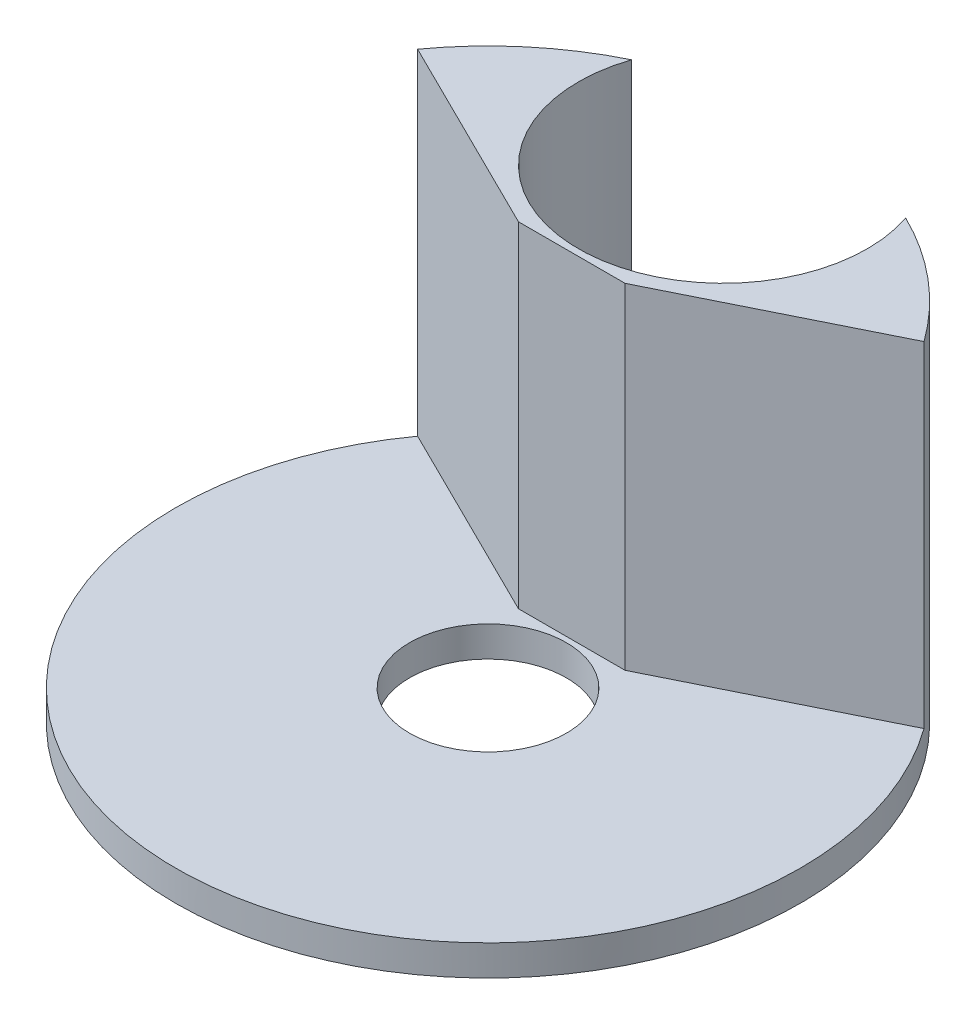
ISO-10303-21;
HEADER;
FILE_DESCRIPTION(('STEP AP214'),'2;1');
FILE_NAME('part.step','',(''),(''),'','','');
FILE_SCHEMA(('AUTOMOTIVE_DESIGN { 1 0 10303 214 1 1 1 1 }'));
ENDSEC;
DATA;
#1=APPLICATION_CONTEXT('core data for automotive mechanical design processes');
#2=APPLICATION_PROTOCOL_DEFINITION('international standard','automotive_design',2000,#1);
#3=PRODUCT_CONTEXT('',#1,'mechanical');
#4=PRODUCT('Part','Part','',(#3));
#5=PRODUCT_RELATED_PRODUCT_CATEGORY('part','',(#4));
#6=PRODUCT_DEFINITION_FORMATION('','',#4);
#7=PRODUCT_DEFINITION_CONTEXT('part definition',#1,'design');
#8=PRODUCT_DEFINITION('design','',#6,#7);
#9=PRODUCT_DEFINITION_SHAPE('','',#8);
#10=(LENGTH_UNIT() NAMED_UNIT(*) SI_UNIT(.MILLI.,.METRE.));
#11=(NAMED_UNIT(*) PLANE_ANGLE_UNIT() SI_UNIT($,.RADIAN.));
#12=(NAMED_UNIT(*) SI_UNIT($,.STERADIAN.) SOLID_ANGLE_UNIT());
#13=UNCERTAINTY_MEASURE_WITH_UNIT(LENGTH_MEASURE(1.E-05),#10,'distance_accuracy_value','');
#14=(GEOMETRIC_REPRESENTATION_CONTEXT(3) GLOBAL_UNCERTAINTY_ASSIGNED_CONTEXT((#13)) GLOBAL_UNIT_ASSIGNED_CONTEXT((#10,
#11,#12)) REPRESENTATION_CONTEXT('',''));
#15=CARTESIAN_POINT('',(0.,0.,0.));
#16=DIRECTION('',(0.,0.,1.));
#17=DIRECTION('',(1.,0.,0.));
#18=AXIS2_PLACEMENT_3D('',#15,#16,#17);
#19=CARTESIAN_POINT('',(0.,2.,0.));
#20=DIRECTION('',(0.,1.,0.));
#21=DIRECTION('',(0.,0.,1.));
#22=AXIS2_PLACEMENT_3D('',#19,#20,#21);
#23=PLANE('',#22);
#24=CARTESIAN_POINT('',(0.,2.,-13.));
#25=DIRECTION('',(0.,1.,0.));
#26=DIRECTION('',(0.,0.,1.));
#27=AXIS2_PLACEMENT_3D('',#24,#25,#26);
#28=CIRCLE('',#27,6.5);
#29=CARTESIAN_POINT('',(0.,2.,-6.5));
#30=VERTEX_POINT('',#29);
#31=EDGE_CURVE('E158',#30,#30,#28,.T.);
#32=ORIENTED_EDGE('',*,*,#31,.F.);
#33=EDGE_LOOP('',(#32));
#34=FACE_BOUND('',#33,.T.);
#35=CARTESIAN_POINT('',(0.,2.,0.));
#36=DIRECTION('',(0.,1.,0.));
#37=DIRECTION('',(0.,0.,1.));
#38=AXIS2_PLACEMENT_3D('',#35,#36,#37);
#39=CIRCLE('',#38,20.5);
#40=CARTESIAN_POINT('',(8.99999999999999,2.,-18.4187404563939));
#41=VERTEX_POINT('',#40);
#42=CARTESIAN_POINT('',(-9.00000000000001,2.,-18.4187404563939));
#43=VERTEX_POINT('',#42);
#44=EDGE_CURVE('E11',#41,#43,#39,.T.);
#45=ORIENTED_EDGE('',*,*,#44,.T.);
#46=CARTESIAN_POINT('',(0.,2.,-15.4184489779728));
#47=DIRECTION('',(0.,1.,0.));
#48=DIRECTION('',(0.,0.,1.));
#49=AXIS2_PLACEMENT_3D('',#46,#47,#48);
#50=CIRCLE('',#49,9.48692515810502);
#51=EDGE_CURVE('E136',#43,#41,#50,.T.);
#52=ORIENTED_EDGE('',*,*,#51,.T.);
#53=EDGE_LOOP('',(#45,#52));
#54=FACE_BOUND('',#53,.T.);
#55=ADVANCED_FACE('F41',(#34,#54),#23,.T.);
#56=CARTESIAN_POINT('',(0.,2.,0.));
#57=DIRECTION('',(0.,-1.,0.));
#58=DIRECTION('',(0.,0.,-1.));
#59=AXIS2_PLACEMENT_3D('',#56,#57,#58);
#60=CYLINDRICAL_SURFACE('',#59,20.5);
#61=ORIENTED_EDGE('',*,*,#44,.F.);
#62=DIRECTION('',(0.,-1.,0.));
#63=VECTOR('',#62,1.);
#64=CARTESIAN_POINT('',(8.99999999999999,24.,-18.4187404563939));
#65=LINE('',#64,#63);
#66=CARTESIAN_POINT('',(8.99999999999999,24.,-18.4187404563939));
#67=VERTEX_POINT('',#66);
#68=EDGE_CURVE('E91',#67,#41,#65,.T.);
#69=ORIENTED_EDGE('',*,*,#68,.F.);
#70=CARTESIAN_POINT('',(0.,24.,0.));
#71=DIRECTION('',(0.,1.,0.));
#72=DIRECTION('',(0.,0.,1.));
#73=AXIS2_PLACEMENT_3D('',#70,#71,#72);
#74=CIRCLE('',#73,20.5);
#75=CARTESIAN_POINT('',(16.6207701385947,24.,-12.));
#76=VERTEX_POINT('',#75);
#77=EDGE_CURVE('E68',#76,#67,#74,.T.);
#78=ORIENTED_EDGE('',*,*,#77,.F.);
#79=DIRECTION('',(0.,-1.,0.));
#80=VECTOR('',#79,1.);
#81=CARTESIAN_POINT('',(16.6207701385947,24.,-12.));
#82=LINE('',#81,#80);
#83=CARTESIAN_POINT('',(16.6207701385947,2.,-12.));
#84=VERTEX_POINT('',#83);
#85=EDGE_CURVE('E125',#76,#84,#82,.T.);
#86=ORIENTED_EDGE('',*,*,#85,.T.);
#87=CARTESIAN_POINT('',(-16.6207701385947,2.,-12.));
#88=VERTEX_POINT('',#87);
#89=EDGE_CURVE('E51',#88,#84,#39,.T.);
#90=ORIENTED_EDGE('',*,*,#89,.F.);
#91=DIRECTION('',(0.,-1.,0.));
#92=VECTOR('',#91,1.);
#93=CARTESIAN_POINT('',(-16.6207701385947,24.,-12.));
#94=LINE('',#93,#92);
#95=CARTESIAN_POINT('',(-16.6207701385947,24.,-12.));
#96=VERTEX_POINT('',#95);
#97=EDGE_CURVE('E59',#96,#88,#94,.T.);
#98=ORIENTED_EDGE('',*,*,#97,.F.);
#99=CARTESIAN_POINT('',(-9.00000000000001,24.,-18.4187404563939));
#100=VERTEX_POINT('',#99);
#101=EDGE_CURVE('E133',#100,#96,#74,.T.);
#102=ORIENTED_EDGE('',*,*,#101,.F.);
#103=DIRECTION('',(0.,-1.,0.));
#104=VECTOR('',#103,1.);
#105=CARTESIAN_POINT('',(-9.00000000000001,24.,-18.4187404563939));
#106=LINE('',#105,#104);
#107=EDGE_CURVE('E96',#100,#43,#106,.T.);
#108=ORIENTED_EDGE('',*,*,#107,.T.);
#109=EDGE_LOOP('',(#61,#69,#78,#86,#90,#98,#102,#108));
#110=FACE_BOUND('',#109,.T.);
#111=CARTESIAN_POINT('',(0.,0.,0.));
#112=DIRECTION('',(0.,1.,0.));
#113=DIRECTION('',(0.,0.,1.));
#114=AXIS2_PLACEMENT_3D('',#111,#112,#113);
#115=CIRCLE('',#114,20.5);
#116=CARTESIAN_POINT('',(0.,0.,20.5));
#117=VERTEX_POINT('',#116);
#118=EDGE_CURVE('E171',#117,#117,#115,.T.);
#119=ORIENTED_EDGE('',*,*,#118,.T.);
#120=EDGE_LOOP('',(#119));
#121=FACE_BOUND('',#120,.T.);
#122=ADVANCED_FACE('F43',(#110,#121),#60,.T.);
#123=DIRECTION('',(0.896070683062667,0.,-0.443911399893724));
#124=VECTOR('',#123,1.);
#125=CARTESIAN_POINT('',(-1.49806729392679,2.,-3.02396871011691));
#126=LINE('',#125,#124);
#127=CARTESIAN_POINT('',(3.5,2.,-5.5));
#128=VERTEX_POINT('',#127);
#129=EDGE_CURVE('E144',#128,#84,#126,.T.);
#130=ORIENTED_EDGE('',*,*,#129,.F.);
#131=DIRECTION('',(1.,0.,0.));
#132=VECTOR('',#131,1.);
#133=CARTESIAN_POINT('',(0.,2.,-5.5));
#134=LINE('',#133,#132);
#135=CARTESIAN_POINT('',(-3.5,2.,-5.5));
#136=VERTEX_POINT('',#135);
#137=EDGE_CURVE('E120',#136,#128,#134,.T.);
#138=ORIENTED_EDGE('',*,*,#137,.F.);
#139=DIRECTION('',(-0.896070683062667,0.,-0.443911399893724));
#140=VECTOR('',#139,1.);
#141=CARTESIAN_POINT('',(1.49806729392679,2.,-3.02396871011691));
#142=LINE('',#141,#140);
#143=EDGE_CURVE('E139',#136,#88,#142,.T.);
#144=ORIENTED_EDGE('',*,*,#143,.T.);
#145=ORIENTED_EDGE('',*,*,#89,.T.);
#146=EDGE_LOOP('',(#130,#138,#144,#145));
#147=FACE_BOUND('',#146,.T.);
#148=CARTESIAN_POINT('',(0.,2.,0.));
#149=DIRECTION('',(0.,1.,0.));
#150=DIRECTION('',(0.,0.,1.));
#151=AXIS2_PLACEMENT_3D('',#148,#149,#150);
#152=CIRCLE('',#151,5.15);
#153=CARTESIAN_POINT('',(0.,2.,5.15));
#154=VERTEX_POINT('',#153);
#155=EDGE_CURVE('E163',#154,#154,#152,.T.);
#156=ORIENTED_EDGE('',*,*,#155,.F.);
#157=EDGE_LOOP('',(#156));
#158=FACE_BOUND('',#157,.T.);
#159=ADVANCED_FACE('F197',(#147,#158),#23,.T.);
#160=CARTESIAN_POINT('',(0.,0.,0.));
#161=DIRECTION('',(0.,1.,0.));
#162=DIRECTION('',(0.,0.,1.));
#163=AXIS2_PLACEMENT_3D('',#160,#161,#162);
#164=PLANE('',#163);
#165=CARTESIAN_POINT('',(0.,0.,-13.));
#166=DIRECTION('',(0.,1.,0.));
#167=DIRECTION('',(0.,0.,1.));
#168=AXIS2_PLACEMENT_3D('',#165,#166,#167);
#169=CIRCLE('',#168,6.5);
#170=CARTESIAN_POINT('',(0.,0.,-6.5));
#171=VERTEX_POINT('',#170);
#172=EDGE_CURVE('E159',#171,#171,#169,.T.);
#173=ORIENTED_EDGE('',*,*,#172,.T.);
#174=EDGE_LOOP('',(#173));
#175=FACE_BOUND('',#174,.T.);
#176=CARTESIAN_POINT('',(0.,0.,0.));
#177=DIRECTION('',(0.,1.,0.));
#178=DIRECTION('',(0.,0.,1.));
#179=AXIS2_PLACEMENT_3D('',#176,#177,#178);
#180=CIRCLE('',#179,5.15);
#181=CARTESIAN_POINT('',(0.,0.,5.15));
#182=VERTEX_POINT('',#181);
#183=EDGE_CURVE('E45',#182,#182,#180,.T.);
#184=ORIENTED_EDGE('',*,*,#183,.T.);
#185=EDGE_LOOP('',(#184));
#186=FACE_BOUND('',#185,.T.);
#187=ORIENTED_EDGE('',*,*,#118,.F.);
#188=EDGE_LOOP('',(#187));
#189=FACE_BOUND('',#188,.T.);
#190=ADVANCED_FACE('F180',(#175,#186,#189),#164,.F.);
#191=CARTESIAN_POINT('',(0.,-1.,0.));
#192=DIRECTION('',(0.,1.,0.));
#193=DIRECTION('',(0.,0.,1.));
#194=AXIS2_PLACEMENT_3D('',#191,#192,#193);
#195=CYLINDRICAL_SURFACE('',#194,5.15);
#196=ORIENTED_EDGE('',*,*,#155,.T.);
#197=EDGE_LOOP('',(#196));
#198=FACE_BOUND('',#197,.T.);
#199=ORIENTED_EDGE('',*,*,#183,.F.);
#200=EDGE_LOOP('',(#199));
#201=FACE_BOUND('',#200,.T.);
#202=ADVANCED_FACE('F183',(#198,#201),#195,.F.);
#203=CARTESIAN_POINT('',(0.,0.,-13.));
#204=DIRECTION('',(0.,1.,0.));
#205=DIRECTION('',(0.,0.,1.));
#206=AXIS2_PLACEMENT_3D('',#203,#204,#205);
#207=CYLINDRICAL_SURFACE('',#206,6.5);
#208=ORIENTED_EDGE('',*,*,#172,.F.);
#209=EDGE_LOOP('',(#208));
#210=FACE_BOUND('',#209,.T.);
#211=ORIENTED_EDGE('',*,*,#31,.T.);
#212=EDGE_LOOP('',(#211));
#213=FACE_BOUND('',#212,.T.);
#214=ADVANCED_FACE('F185',(#210,#213),#207,.F.);
#215=CARTESIAN_POINT('',(0.,24.,-15.4184489779728));
#216=DIRECTION('',(0.,-1.,0.));
#217=DIRECTION('',(0.,0.,-1.));
#218=AXIS2_PLACEMENT_3D('',#215,#216,#217);
#219=CYLINDRICAL_SURFACE('',#218,9.48692515810502);
#220=ORIENTED_EDGE('',*,*,#51,.F.);
#221=ORIENTED_EDGE('',*,*,#107,.F.);
#222=CARTESIAN_POINT('',(0.,24.,-15.4184489779728));
#223=DIRECTION('',(0.,1.,0.));
#224=DIRECTION('',(0.,0.,1.));
#225=AXIS2_PLACEMENT_3D('',#222,#223,#224);
#226=CIRCLE('',#225,9.48692515810502);
#227=EDGE_CURVE('E147',#100,#67,#226,.T.);
#228=ORIENTED_EDGE('',*,*,#227,.T.);
#229=ORIENTED_EDGE('',*,*,#68,.T.);
#230=EDGE_LOOP('',(#220,#221,#228,#229));
#231=FACE_BOUND('',#230,.T.);
#232=ADVANCED_FACE('F193',(#231),#219,.F.);
#233=CARTESIAN_POINT('',(1.49806729392679,24.,-3.02396871011691));
#234=DIRECTION('',(-0.443911399893724,0.,0.896070683062667));
#235=DIRECTION('',(0.896070683062667,0.,0.443911399893724));
#236=AXIS2_PLACEMENT_3D('',#233,#234,#235);
#237=PLANE('',#236);
#238=ORIENTED_EDGE('',*,*,#143,.F.);
#239=DIRECTION('',(0.,-1.,0.));
#240=VECTOR('',#239,1.);
#241=CARTESIAN_POINT('',(-3.5,24.,-5.5));
#242=LINE('',#241,#240);
#243=CARTESIAN_POINT('',(-3.5,24.,-5.5));
#244=VERTEX_POINT('',#243);
#245=EDGE_CURVE('E124',#244,#136,#242,.T.);
#246=ORIENTED_EDGE('',*,*,#245,.F.);
#247=DIRECTION('',(-0.896070683062667,0.,-0.443911399893724));
#248=VECTOR('',#247,1.);
#249=CARTESIAN_POINT('',(1.49806729392679,24.,-3.02396871011691));
#250=LINE('',#249,#248);
#251=EDGE_CURVE('E112',#244,#96,#250,.T.);
#252=ORIENTED_EDGE('',*,*,#251,.T.);
#253=ORIENTED_EDGE('',*,*,#97,.T.);
#254=EDGE_LOOP('',(#238,#246,#252,#253));
#255=FACE_BOUND('',#254,.T.);
#256=ADVANCED_FACE('F222',(#255),#237,.T.);
#257=CARTESIAN_POINT('',(0.,24.,-5.5));
#258=DIRECTION('',(0.,0.,-1.));
#259=DIRECTION('',(-1.,0.,0.));
#260=AXIS2_PLACEMENT_3D('',#257,#258,#259);
#261=PLANE('',#260);
#262=ORIENTED_EDGE('',*,*,#137,.T.);
#263=DIRECTION('',(0.,-1.,0.));
#264=VECTOR('',#263,1.);
#265=CARTESIAN_POINT('',(3.5,24.,-5.5));
#266=LINE('',#265,#264);
#267=CARTESIAN_POINT('',(3.5,24.,-5.5));
#268=VERTEX_POINT('',#267);
#269=EDGE_CURVE('E117',#268,#128,#266,.T.);
#270=ORIENTED_EDGE('',*,*,#269,.F.);
#271=DIRECTION('',(1.,0.,0.));
#272=VECTOR('',#271,1.);
#273=CARTESIAN_POINT('',(0.,24.,-5.5));
#274=LINE('',#273,#272);
#275=EDGE_CURVE('E106',#244,#268,#274,.T.);
#276=ORIENTED_EDGE('',*,*,#275,.F.);
#277=ORIENTED_EDGE('',*,*,#245,.T.);
#278=EDGE_LOOP('',(#262,#270,#276,#277));
#279=FACE_BOUND('',#278,.T.);
#280=ADVANCED_FACE('F118',(#279),#261,.F.);
#281=CARTESIAN_POINT('',(-1.49806729392679,24.,-3.02396871011691));
#282=DIRECTION('',(-0.443911399893724,0.,-0.896070683062667));
#283=DIRECTION('',(-0.896070683062667,0.,0.443911399893724));
#284=AXIS2_PLACEMENT_3D('',#281,#282,#283);
#285=PLANE('',#284);
#286=ORIENTED_EDGE('',*,*,#129,.T.);
#287=ORIENTED_EDGE('',*,*,#85,.F.);
#288=DIRECTION('',(0.896070683062667,0.,-0.443911399893724));
#289=VECTOR('',#288,1.);
#290=CARTESIAN_POINT('',(-1.49806729392679,24.,-3.02396871011691));
#291=LINE('',#290,#289);
#292=EDGE_CURVE('E110',#268,#76,#291,.T.);
#293=ORIENTED_EDGE('',*,*,#292,.F.);
#294=ORIENTED_EDGE('',*,*,#269,.T.);
#295=EDGE_LOOP('',(#286,#287,#293,#294));
#296=FACE_BOUND('',#295,.T.);
#297=ADVANCED_FACE('F127',(#296),#285,.F.);
#298=CARTESIAN_POINT('',(0.,24.,0.));
#299=DIRECTION('',(0.,1.,0.));
#300=DIRECTION('',(0.,0.,1.));
#301=AXIS2_PLACEMENT_3D('',#298,#299,#300);
#302=PLANE('',#301);
#303=ORIENTED_EDGE('',*,*,#227,.F.);
#304=ORIENTED_EDGE('',*,*,#101,.T.);
#305=ORIENTED_EDGE('',*,*,#251,.F.);
#306=ORIENTED_EDGE('',*,*,#275,.T.);
#307=ORIENTED_EDGE('',*,*,#292,.T.);
#308=ORIENTED_EDGE('',*,*,#77,.T.);
#309=EDGE_LOOP('',(#303,#304,#305,#306,#307,#308));
#310=FACE_BOUND('',#309,.T.);
#311=ADVANCED_FACE('F108',(#310),#302,.T.);
#312=CLOSED_SHELL('',(#55,#122,#159,#190,#202,#214,#232,#256,#280,#297,#311));
#313=MANIFOLD_SOLID_BREP('B2',#312);
#314=ADVANCED_BREP_SHAPE_REPRESENTATION('',(#18,#313),#14);
#315=SHAPE_DEFINITION_REPRESENTATION(#9,#314);
ENDSEC;
END-ISO-10303-21;
